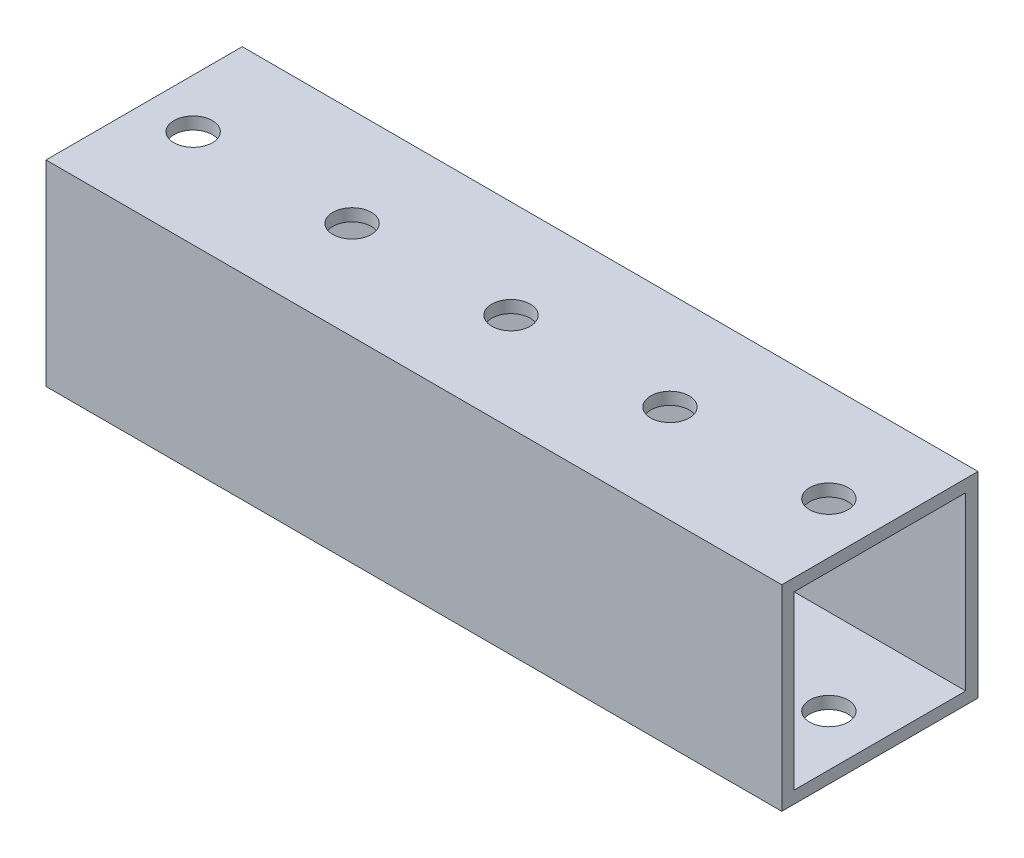
ISO-10303-21;
HEADER;
FILE_DESCRIPTION(('STEP AP214'),'2;1');
FILE_NAME('part.step','',(''),(''),'','','');
FILE_SCHEMA(('AUTOMOTIVE_DESIGN { 1 0 10303 214 1 1 1 1 }'));
ENDSEC;
DATA;
#1=APPLICATION_CONTEXT('core data for automotive mechanical design processes');
#2=APPLICATION_PROTOCOL_DEFINITION('international standard','automotive_design',2000,#1);
#3=PRODUCT_CONTEXT('',#1,'mechanical');
#4=PRODUCT('Part','Part','',(#3));
#5=PRODUCT_RELATED_PRODUCT_CATEGORY('part','',(#4));
#6=PRODUCT_DEFINITION_FORMATION('','',#4);
#7=PRODUCT_DEFINITION_CONTEXT('part definition',#1,'design');
#8=PRODUCT_DEFINITION('design','',#6,#7);
#9=PRODUCT_DEFINITION_SHAPE('','',#8);
#10=(LENGTH_UNIT() NAMED_UNIT(*) SI_UNIT(.MILLI.,.METRE.));
#11=(NAMED_UNIT(*) PLANE_ANGLE_UNIT() SI_UNIT($,.RADIAN.));
#12=(NAMED_UNIT(*) SI_UNIT($,.STERADIAN.) SOLID_ANGLE_UNIT());
#13=UNCERTAINTY_MEASURE_WITH_UNIT(LENGTH_MEASURE(1.E-05),#10,'distance_accuracy_value','');
#14=(GEOMETRIC_REPRESENTATION_CONTEXT(3) GLOBAL_UNCERTAINTY_ASSIGNED_CONTEXT((#13)) GLOBAL_UNIT_ASSIGNED_CONTEXT((#10,
#11,#12)) REPRESENTATION_CONTEXT('',''));
#15=CARTESIAN_POINT('',(0.,0.,0.));
#16=DIRECTION('',(0.,0.,1.));
#17=DIRECTION('',(1.,0.,0.));
#18=AXIS2_PLACEMENT_3D('',#15,#16,#17);
#19=CARTESIAN_POINT('',(95.25,0.,0.));
#20=DIRECTION('',(-1.,0.,0.));
#21=DIRECTION('',(0.,0.,1.));
#22=AXIS2_PLACEMENT_3D('',#19,#20,#21);
#23=PLANE('',#22);
#24=DIRECTION('',(0.,-1.,0.));
#25=VECTOR('',#24,1.);
#26=CARTESIAN_POINT('',(95.25,0.,0.));
#27=LINE('',#26,#25);
#28=CARTESIAN_POINT('',(95.25,25.4,0.));
#29=VERTEX_POINT('',#28);
#30=CARTESIAN_POINT('',(95.25,0.,0.));
#31=VERTEX_POINT('',#30);
#32=EDGE_CURVE('E138',#29,#31,#27,.T.);
#33=ORIENTED_EDGE('',*,*,#32,.T.);
#34=DIRECTION('',(0.,0.,-1.));
#35=VECTOR('',#34,1.);
#36=CARTESIAN_POINT('',(95.25,0.,0.));
#37=LINE('',#36,#35);
#38=CARTESIAN_POINT('',(95.25,0.,-25.4));
#39=VERTEX_POINT('',#38);
#40=EDGE_CURVE('E141',#31,#39,#37,.T.);
#41=ORIENTED_EDGE('',*,*,#40,.T.);
#42=DIRECTION('',(0.,1.,0.));
#43=VECTOR('',#42,1.);
#44=CARTESIAN_POINT('',(95.25,0.,-25.4));
#45=LINE('',#44,#43);
#46=CARTESIAN_POINT('',(95.25,25.4,-25.4));
#47=VERTEX_POINT('',#46);
#48=EDGE_CURVE('E144',#39,#47,#45,.T.);
#49=ORIENTED_EDGE('',*,*,#48,.T.);
#50=DIRECTION('',(0.,0.,1.));
#51=VECTOR('',#50,1.);
#52=CARTESIAN_POINT('',(95.25,25.4,0.));
#53=LINE('',#52,#51);
#54=EDGE_CURVE('E146',#47,#29,#53,.T.);
#55=ORIENTED_EDGE('',*,*,#54,.T.);
#56=EDGE_LOOP('',(#33,#41,#49,#55));
#57=FACE_BOUND('',#56,.T.);
#58=DIRECTION('',(0.,-1.,0.));
#59=VECTOR('',#58,1.);
#60=CARTESIAN_POINT('',(95.25,1.5875,-1.5875));
#61=LINE('',#60,#59);
#62=CARTESIAN_POINT('',(95.25,23.8125,-1.5875));
#63=VERTEX_POINT('',#62);
#64=CARTESIAN_POINT('',(95.25,1.5875,-1.5875));
#65=VERTEX_POINT('',#64);
#66=EDGE_CURVE('E100',#63,#65,#61,.T.);
#67=ORIENTED_EDGE('',*,*,#66,.F.);
#68=DIRECTION('',(0.,0.,1.));
#69=VECTOR('',#68,1.);
#70=CARTESIAN_POINT('',(95.25,23.8125,-1.5875));
#71=LINE('',#70,#69);
#72=CARTESIAN_POINT('',(95.25,23.8125,-23.8125));
#73=VERTEX_POINT('',#72);
#74=EDGE_CURVE('E122',#73,#63,#71,.T.);
#75=ORIENTED_EDGE('',*,*,#74,.F.);
#76=DIRECTION('',(0.,1.,0.));
#77=VECTOR('',#76,1.);
#78=CARTESIAN_POINT('',(95.25,1.5875,-23.8125));
#79=LINE('',#78,#77);
#80=CARTESIAN_POINT('',(95.25,1.5875,-23.8125));
#81=VERTEX_POINT('',#80);
#82=EDGE_CURVE('E120',#81,#73,#79,.T.);
#83=ORIENTED_EDGE('',*,*,#82,.F.);
#84=DIRECTION('',(0.,0.,-1.));
#85=VECTOR('',#84,1.);
#86=CARTESIAN_POINT('',(95.25,1.5875,-1.5875));
#87=LINE('',#86,#85);
#88=EDGE_CURVE('E108',#65,#81,#87,.T.);
#89=ORIENTED_EDGE('',*,*,#88,.F.);
#90=EDGE_LOOP('',(#67,#75,#83,#89));
#91=FACE_BOUND('',#90,.T.);
#92=ADVANCED_FACE('F33',(#57,#91),#23,.F.);
#93=CARTESIAN_POINT('',(0.,0.,0.));
#94=DIRECTION('',(-1.,0.,0.));
#95=DIRECTION('',(0.,0.,1.));
#96=AXIS2_PLACEMENT_3D('',#93,#94,#95);
#97=PLANE('',#96);
#98=DIRECTION('',(0.,-1.,0.));
#99=VECTOR('',#98,1.);
#100=CARTESIAN_POINT('',(0.,0.,0.));
#101=LINE('',#100,#99);
#102=CARTESIAN_POINT('',(0.,25.4,0.));
#103=VERTEX_POINT('',#102);
#104=CARTESIAN_POINT('',(0.,0.,0.));
#105=VERTEX_POINT('',#104);
#106=EDGE_CURVE('E116',#103,#105,#101,.T.);
#107=ORIENTED_EDGE('',*,*,#106,.F.);
#108=DIRECTION('',(0.,0.,1.));
#109=VECTOR('',#108,1.);
#110=CARTESIAN_POINT('',(0.,25.4,0.));
#111=LINE('',#110,#109);
#112=CARTESIAN_POINT('',(0.,25.4,-25.4));
#113=VERTEX_POINT('',#112);
#114=EDGE_CURVE('E142',#113,#103,#111,.T.);
#115=ORIENTED_EDGE('',*,*,#114,.F.);
#116=DIRECTION('',(0.,1.,0.));
#117=VECTOR('',#116,1.);
#118=CARTESIAN_POINT('',(0.,0.,-25.4));
#119=LINE('',#118,#117);
#120=CARTESIAN_POINT('',(0.,0.,-25.4));
#121=VERTEX_POINT('',#120);
#122=EDGE_CURVE('E153',#121,#113,#119,.T.);
#123=ORIENTED_EDGE('',*,*,#122,.F.);
#124=DIRECTION('',(0.,0.,-1.));
#125=VECTOR('',#124,1.);
#126=CARTESIAN_POINT('',(0.,0.,0.));
#127=LINE('',#126,#125);
#128=EDGE_CURVE('E151',#105,#121,#127,.T.);
#129=ORIENTED_EDGE('',*,*,#128,.F.);
#130=EDGE_LOOP('',(#107,#115,#123,#129));
#131=FACE_BOUND('',#130,.T.);
#132=DIRECTION('',(0.,0.,1.));
#133=VECTOR('',#132,1.);
#134=CARTESIAN_POINT('',(0.,23.8125,-1.5875));
#135=LINE('',#134,#133);
#136=CARTESIAN_POINT('',(0.,23.8125,-23.8125));
#137=VERTEX_POINT('',#136);
#138=CARTESIAN_POINT('',(0.,23.8125,-1.5875));
#139=VERTEX_POINT('',#138);
#140=EDGE_CURVE('E109',#137,#139,#135,.T.);
#141=ORIENTED_EDGE('',*,*,#140,.T.);
#142=DIRECTION('',(0.,-1.,0.));
#143=VECTOR('',#142,1.);
#144=CARTESIAN_POINT('',(0.,1.5875,-1.5875));
#145=LINE('',#144,#143);
#146=CARTESIAN_POINT('',(0.,1.5875,-1.5875));
#147=VERTEX_POINT('',#146);
#148=EDGE_CURVE('E58',#139,#147,#145,.T.);
#149=ORIENTED_EDGE('',*,*,#148,.T.);
#150=DIRECTION('',(0.,0.,-1.));
#151=VECTOR('',#150,1.);
#152=CARTESIAN_POINT('',(0.,1.5875,-1.5875));
#153=LINE('',#152,#151);
#154=CARTESIAN_POINT('',(0.,1.5875,-23.8125));
#155=VERTEX_POINT('',#154);
#156=EDGE_CURVE('E115',#147,#155,#153,.T.);
#157=ORIENTED_EDGE('',*,*,#156,.T.);
#158=DIRECTION('',(0.,1.,0.));
#159=VECTOR('',#158,1.);
#160=CARTESIAN_POINT('',(0.,1.5875,-23.8125));
#161=LINE('',#160,#159);
#162=EDGE_CURVE('E130',#155,#137,#161,.T.);
#163=ORIENTED_EDGE('',*,*,#162,.T.);
#164=EDGE_LOOP('',(#141,#149,#157,#163));
#165=FACE_BOUND('',#164,.T.);
#166=ADVANCED_FACE('F221',(#131,#165),#97,.T.);
#167=CARTESIAN_POINT('',(95.25,0.,0.));
#168=DIRECTION('',(0.,0.,-1.));
#169=DIRECTION('',(-1.,0.,0.));
#170=AXIS2_PLACEMENT_3D('',#167,#168,#169);
#171=PLANE('',#170);
#172=ORIENTED_EDGE('',*,*,#106,.T.);
#173=DIRECTION('',(-1.,0.,0.));
#174=VECTOR('',#173,1.);
#175=CARTESIAN_POINT('',(95.25,0.,0.));
#176=LINE('',#175,#174);
#177=EDGE_CURVE('E11',#31,#105,#176,.T.);
#178=ORIENTED_EDGE('',*,*,#177,.F.);
#179=ORIENTED_EDGE('',*,*,#32,.F.);
#180=DIRECTION('',(-1.,0.,0.));
#181=VECTOR('',#180,1.);
#182=CARTESIAN_POINT('',(95.25,25.4,0.));
#183=LINE('',#182,#181);
#184=EDGE_CURVE('E148',#29,#103,#183,.T.);
#185=ORIENTED_EDGE('',*,*,#184,.T.);
#186=EDGE_LOOP('',(#172,#178,#179,#185));
#187=FACE_BOUND('',#186,.T.);
#188=ADVANCED_FACE('F35',(#187),#171,.F.);
#189=CARTESIAN_POINT('',(95.25,0.,0.));
#190=DIRECTION('',(0.,1.,0.));
#191=DIRECTION('',(0.,0.,1.));
#192=AXIS2_PLACEMENT_3D('',#189,#190,#191);
#193=PLANE('',#192);
#194=CARTESIAN_POINT('',(6.35,0.,-12.7));
#195=DIRECTION('',(0.,1.,0.));
#196=DIRECTION('',(0.,0.,1.));
#197=AXIS2_PLACEMENT_3D('',#194,#195,#196);
#198=CIRCLE('',#197,2.4892);
#199=CARTESIAN_POINT('',(6.35,0.,-10.2108));
#200=VERTEX_POINT('',#199);
#201=EDGE_CURVE('E128',#200,#200,#198,.T.);
#202=ORIENTED_EDGE('',*,*,#201,.T.);
#203=EDGE_LOOP('',(#202));
#204=FACE_BOUND('',#203,.T.);
#205=CARTESIAN_POINT('',(26.924,0.,-12.7));
#206=DIRECTION('',(0.,1.,0.));
#207=DIRECTION('',(0.,0.,1.));
#208=AXIS2_PLACEMENT_3D('',#205,#206,#207);
#209=CIRCLE('',#208,2.4892);
#210=CARTESIAN_POINT('',(26.924,0.,-10.2108));
#211=VERTEX_POINT('',#210);
#212=EDGE_CURVE('E184',#211,#211,#209,.T.);
#213=ORIENTED_EDGE('',*,*,#212,.T.);
#214=EDGE_LOOP('',(#213));
#215=FACE_BOUND('',#214,.T.);
#216=CARTESIAN_POINT('',(47.498,0.,-12.7));
#217=DIRECTION('',(0.,1.,0.));
#218=DIRECTION('',(0.,0.,1.));
#219=AXIS2_PLACEMENT_3D('',#216,#217,#218);
#220=CIRCLE('',#219,2.4892);
#221=CARTESIAN_POINT('',(47.498,0.,-10.2108));
#222=VERTEX_POINT('',#221);
#223=EDGE_CURVE('E180',#222,#222,#220,.T.);
#224=ORIENTED_EDGE('',*,*,#223,.T.);
#225=EDGE_LOOP('',(#224));
#226=FACE_BOUND('',#225,.T.);
#227=CARTESIAN_POINT('',(68.072,0.,-12.7));
#228=DIRECTION('',(0.,1.,0.));
#229=DIRECTION('',(0.,0.,1.));
#230=AXIS2_PLACEMENT_3D('',#227,#228,#229);
#231=CIRCLE('',#230,2.4892);
#232=CARTESIAN_POINT('',(68.072,0.,-10.2108));
#233=VERTEX_POINT('',#232);
#234=EDGE_CURVE('E176',#233,#233,#231,.T.);
#235=ORIENTED_EDGE('',*,*,#234,.T.);
#236=EDGE_LOOP('',(#235));
#237=FACE_BOUND('',#236,.T.);
#238=CARTESIAN_POINT('',(88.646,0.,-12.7));
#239=DIRECTION('',(0.,1.,0.));
#240=DIRECTION('',(0.,0.,1.));
#241=AXIS2_PLACEMENT_3D('',#238,#239,#240);
#242=CIRCLE('',#241,2.4892);
#243=CARTESIAN_POINT('',(88.646,0.,-10.2108));
#244=VERTEX_POINT('',#243);
#245=EDGE_CURVE('E172',#244,#244,#242,.T.);
#246=ORIENTED_EDGE('',*,*,#245,.T.);
#247=EDGE_LOOP('',(#246));
#248=FACE_BOUND('',#247,.T.);
#249=ORIENTED_EDGE('',*,*,#128,.T.);
#250=DIRECTION('',(-1.,0.,0.));
#251=VECTOR('',#250,1.);
#252=CARTESIAN_POINT('',(95.25,0.,-25.4));
#253=LINE('',#252,#251);
#254=EDGE_CURVE('E42',#39,#121,#253,.T.);
#255=ORIENTED_EDGE('',*,*,#254,.F.);
#256=ORIENTED_EDGE('',*,*,#40,.F.);
#257=ORIENTED_EDGE('',*,*,#177,.T.);
#258=EDGE_LOOP('',(#249,#255,#256,#257));
#259=FACE_BOUND('',#258,.T.);
#260=ADVANCED_FACE('F201',(#204,#215,#226,#237,#248,#259),#193,.F.);
#261=CARTESIAN_POINT('',(95.25,0.,-25.4));
#262=DIRECTION('',(0.,0.,1.));
#263=DIRECTION('',(1.,0.,0.));
#264=AXIS2_PLACEMENT_3D('',#261,#262,#263);
#265=PLANE('',#264);
#266=ORIENTED_EDGE('',*,*,#122,.T.);
#267=DIRECTION('',(-1.,0.,0.));
#268=VECTOR('',#267,1.);
#269=CARTESIAN_POINT('',(95.25,25.4,-25.4));
#270=LINE('',#269,#268);
#271=EDGE_CURVE('E158',#47,#113,#270,.T.);
#272=ORIENTED_EDGE('',*,*,#271,.F.);
#273=ORIENTED_EDGE('',*,*,#48,.F.);
#274=ORIENTED_EDGE('',*,*,#254,.T.);
#275=EDGE_LOOP('',(#266,#272,#273,#274));
#276=FACE_BOUND('',#275,.T.);
#277=ADVANCED_FACE('F235',(#276),#265,.F.);
#278=CARTESIAN_POINT('',(95.25,25.4,0.));
#279=DIRECTION('',(0.,-1.,0.));
#280=DIRECTION('',(0.,0.,-1.));
#281=AXIS2_PLACEMENT_3D('',#278,#279,#280);
#282=PLANE('',#281);
#283=CARTESIAN_POINT('',(6.35,25.4,-12.7));
#284=DIRECTION('',(0.,1.,0.));
#285=DIRECTION('',(0.,0.,1.));
#286=AXIS2_PLACEMENT_3D('',#283,#284,#285);
#287=CIRCLE('',#286,2.4892);
#288=CARTESIAN_POINT('',(6.35,25.4,-10.2108));
#289=VERTEX_POINT('',#288);
#290=EDGE_CURVE('E167',#289,#289,#287,.T.);
#291=ORIENTED_EDGE('',*,*,#290,.F.);
#292=EDGE_LOOP('',(#291));
#293=FACE_BOUND('',#292,.T.);
#294=CARTESIAN_POINT('',(26.924,25.4,-12.7));
#295=DIRECTION('',(0.,1.,0.));
#296=DIRECTION('',(0.,0.,1.));
#297=AXIS2_PLACEMENT_3D('',#294,#295,#296);
#298=CIRCLE('',#297,2.4892);
#299=CARTESIAN_POINT('',(26.924,25.4,-10.2108));
#300=VERTEX_POINT('',#299);
#301=EDGE_CURVE('E331',#300,#300,#298,.T.);
#302=ORIENTED_EDGE('',*,*,#301,.F.);
#303=EDGE_LOOP('',(#302));
#304=FACE_BOUND('',#303,.T.);
#305=CARTESIAN_POINT('',(47.498,25.4,-12.7));
#306=DIRECTION('',(0.,1.,0.));
#307=DIRECTION('',(0.,0.,1.));
#308=AXIS2_PLACEMENT_3D('',#305,#306,#307);
#309=CIRCLE('',#308,2.4892);
#310=CARTESIAN_POINT('',(47.498,25.4,-10.2108));
#311=VERTEX_POINT('',#310);
#312=EDGE_CURVE('E329',#311,#311,#309,.T.);
#313=ORIENTED_EDGE('',*,*,#312,.F.);
#314=EDGE_LOOP('',(#313));
#315=FACE_BOUND('',#314,.T.);
#316=CARTESIAN_POINT('',(68.072,25.4,-12.7));
#317=DIRECTION('',(0.,1.,0.));
#318=DIRECTION('',(0.,0.,1.));
#319=AXIS2_PLACEMENT_3D('',#316,#317,#318);
#320=CIRCLE('',#319,2.4892);
#321=CARTESIAN_POINT('',(68.072,25.4,-10.2108));
#322=VERTEX_POINT('',#321);
#323=EDGE_CURVE('E327',#322,#322,#320,.T.);
#324=ORIENTED_EDGE('',*,*,#323,.F.);
#325=EDGE_LOOP('',(#324));
#326=FACE_BOUND('',#325,.T.);
#327=CARTESIAN_POINT('',(88.646,25.4,-12.7));
#328=DIRECTION('',(0.,1.,0.));
#329=DIRECTION('',(0.,0.,1.));
#330=AXIS2_PLACEMENT_3D('',#327,#328,#329);
#331=CIRCLE('',#330,2.4892);
#332=CARTESIAN_POINT('',(88.646,25.4,-10.2108));
#333=VERTEX_POINT('',#332);
#334=EDGE_CURVE('E299',#333,#333,#331,.T.);
#335=ORIENTED_EDGE('',*,*,#334,.F.);
#336=EDGE_LOOP('',(#335));
#337=FACE_BOUND('',#336,.T.);
#338=ORIENTED_EDGE('',*,*,#114,.T.);
#339=ORIENTED_EDGE('',*,*,#184,.F.);
#340=ORIENTED_EDGE('',*,*,#54,.F.);
#341=ORIENTED_EDGE('',*,*,#271,.T.);
#342=EDGE_LOOP('',(#338,#339,#340,#341));
#343=FACE_BOUND('',#342,.T.);
#344=ADVANCED_FACE('F232',(#293,#304,#315,#326,#337,#343),#282,.F.);
#345=CARTESIAN_POINT('',(95.25,1.5875,-1.5875));
#346=DIRECTION('',(0.,0.,-1.));
#347=DIRECTION('',(-1.,0.,0.));
#348=AXIS2_PLACEMENT_3D('',#345,#346,#347);
#349=PLANE('',#348);
#350=ORIENTED_EDGE('',*,*,#148,.F.);
#351=DIRECTION('',(-1.,0.,0.));
#352=VECTOR('',#351,1.);
#353=CARTESIAN_POINT('',(95.25,23.8125,-1.5875));
#354=LINE('',#353,#352);
#355=EDGE_CURVE('E104',#63,#139,#354,.T.);
#356=ORIENTED_EDGE('',*,*,#355,.F.);
#357=ORIENTED_EDGE('',*,*,#66,.T.);
#358=DIRECTION('',(-1.,0.,0.));
#359=VECTOR('',#358,1.);
#360=CARTESIAN_POINT('',(95.25,1.5875,-1.5875));
#361=LINE('',#360,#359);
#362=EDGE_CURVE('E103',#65,#147,#361,.T.);
#363=ORIENTED_EDGE('',*,*,#362,.T.);
#364=EDGE_LOOP('',(#350,#356,#357,#363));
#365=FACE_BOUND('',#364,.T.);
#366=ADVANCED_FACE('F102',(#365),#349,.T.);
#367=CARTESIAN_POINT('',(95.25,1.5875,-1.5875));
#368=DIRECTION('',(0.,1.,0.));
#369=DIRECTION('',(0.,0.,1.));
#370=AXIS2_PLACEMENT_3D('',#367,#368,#369);
#371=PLANE('',#370);
#372=CARTESIAN_POINT('',(6.35,1.58750000000001,-12.7));
#373=DIRECTION('',(0.,1.,0.));
#374=DIRECTION('',(0.,0.,1.));
#375=AXIS2_PLACEMENT_3D('',#372,#373,#374);
#376=CIRCLE('',#375,2.4892);
#377=CARTESIAN_POINT('',(6.35,1.58750000000001,-10.2108));
#378=VERTEX_POINT('',#377);
#379=EDGE_CURVE('E196',#378,#378,#376,.T.);
#380=ORIENTED_EDGE('',*,*,#379,.F.);
#381=EDGE_LOOP('',(#380));
#382=FACE_BOUND('',#381,.T.);
#383=CARTESIAN_POINT('',(26.924,1.58750000000001,-12.7));
#384=DIRECTION('',(0.,1.,0.));
#385=DIRECTION('',(0.,0.,1.));
#386=AXIS2_PLACEMENT_3D('',#383,#384,#385);
#387=CIRCLE('',#386,2.4892);
#388=CARTESIAN_POINT('',(26.924,1.58750000000001,-10.2108));
#389=VERTEX_POINT('',#388);
#390=EDGE_CURVE('E179',#389,#389,#387,.T.);
#391=ORIENTED_EDGE('',*,*,#390,.F.);
#392=EDGE_LOOP('',(#391));
#393=FACE_BOUND('',#392,.T.);
#394=CARTESIAN_POINT('',(47.498,1.58750000000001,-12.7));
#395=DIRECTION('',(0.,1.,0.));
#396=DIRECTION('',(0.,0.,1.));
#397=AXIS2_PLACEMENT_3D('',#394,#395,#396);
#398=CIRCLE('',#397,2.4892);
#399=CARTESIAN_POINT('',(47.498,1.58750000000001,-10.2108));
#400=VERTEX_POINT('',#399);
#401=EDGE_CURVE('E175',#400,#400,#398,.T.);
#402=ORIENTED_EDGE('',*,*,#401,.F.);
#403=EDGE_LOOP('',(#402));
#404=FACE_BOUND('',#403,.T.);
#405=CARTESIAN_POINT('',(68.072,1.58750000000001,-12.7));
#406=DIRECTION('',(0.,1.,0.));
#407=DIRECTION('',(0.,0.,1.));
#408=AXIS2_PLACEMENT_3D('',#405,#406,#407);
#409=CIRCLE('',#408,2.4892);
#410=CARTESIAN_POINT('',(68.072,1.58750000000001,-10.2108));
#411=VERTEX_POINT('',#410);
#412=EDGE_CURVE('E171',#411,#411,#409,.T.);
#413=ORIENTED_EDGE('',*,*,#412,.F.);
#414=EDGE_LOOP('',(#413));
#415=FACE_BOUND('',#414,.T.);
#416=CARTESIAN_POINT('',(88.646,1.58750000000001,-12.7));
#417=DIRECTION('',(0.,1.,0.));
#418=DIRECTION('',(0.,0.,1.));
#419=AXIS2_PLACEMENT_3D('',#416,#417,#418);
#420=CIRCLE('',#419,2.4892);
#421=CARTESIAN_POINT('',(88.646,1.58750000000001,-10.2108));
#422=VERTEX_POINT('',#421);
#423=EDGE_CURVE('E166',#422,#422,#420,.T.);
#424=ORIENTED_EDGE('',*,*,#423,.F.);
#425=EDGE_LOOP('',(#424));
#426=FACE_BOUND('',#425,.T.);
#427=ORIENTED_EDGE('',*,*,#156,.F.);
#428=ORIENTED_EDGE('',*,*,#362,.F.);
#429=ORIENTED_EDGE('',*,*,#88,.T.);
#430=DIRECTION('',(-1.,0.,0.));
#431=VECTOR('',#430,1.);
#432=CARTESIAN_POINT('',(95.25,1.5875,-23.8125));
#433=LINE('',#432,#431);
#434=EDGE_CURVE('E117',#81,#155,#433,.T.);
#435=ORIENTED_EDGE('',*,*,#434,.T.);
#436=EDGE_LOOP('',(#427,#428,#429,#435));
#437=FACE_BOUND('',#436,.T.);
#438=ADVANCED_FACE('F112',(#382,#393,#404,#415,#426,#437),#371,.T.);
#439=CARTESIAN_POINT('',(95.25,1.5875,-23.8125));
#440=DIRECTION('',(0.,0.,1.));
#441=DIRECTION('',(1.,0.,0.));
#442=AXIS2_PLACEMENT_3D('',#439,#440,#441);
#443=PLANE('',#442);
#444=ORIENTED_EDGE('',*,*,#162,.F.);
#445=ORIENTED_EDGE('',*,*,#434,.F.);
#446=ORIENTED_EDGE('',*,*,#82,.T.);
#447=DIRECTION('',(-1.,0.,0.));
#448=VECTOR('',#447,1.);
#449=CARTESIAN_POINT('',(95.25,23.8125,-23.8125));
#450=LINE('',#449,#448);
#451=EDGE_CURVE('E50',#73,#137,#450,.T.);
#452=ORIENTED_EDGE('',*,*,#451,.T.);
#453=EDGE_LOOP('',(#444,#445,#446,#452));
#454=FACE_BOUND('',#453,.T.);
#455=ADVANCED_FACE('F263',(#454),#443,.T.);
#456=CARTESIAN_POINT('',(95.25,23.8125,-1.5875));
#457=DIRECTION('',(0.,-1.,0.));
#458=DIRECTION('',(0.,0.,-1.));
#459=AXIS2_PLACEMENT_3D('',#456,#457,#458);
#460=PLANE('',#459);
#461=CARTESIAN_POINT('',(6.35,23.8125,-12.7));
#462=DIRECTION('',(0.,-1.,0.));
#463=DIRECTION('',(0.,0.,-1.));
#464=AXIS2_PLACEMENT_3D('',#461,#462,#463);
#465=CIRCLE('',#464,2.4892);
#466=CARTESIAN_POINT('',(6.35,23.8125,-15.1892));
#467=VERTEX_POINT('',#466);
#468=EDGE_CURVE('E37',#467,#467,#465,.T.);
#469=ORIENTED_EDGE('',*,*,#468,.F.);
#470=EDGE_LOOP('',(#469));
#471=FACE_BOUND('',#470,.T.);
#472=CARTESIAN_POINT('',(26.924,23.8125,-12.7));
#473=DIRECTION('',(0.,-1.,0.));
#474=DIRECTION('',(0.,0.,-1.));
#475=AXIS2_PLACEMENT_3D('',#472,#473,#474);
#476=CIRCLE('',#475,2.4892);
#477=CARTESIAN_POINT('',(26.924,23.8125,-15.1892));
#478=VERTEX_POINT('',#477);
#479=EDGE_CURVE('E177',#478,#478,#476,.T.);
#480=ORIENTED_EDGE('',*,*,#479,.F.);
#481=EDGE_LOOP('',(#480));
#482=FACE_BOUND('',#481,.T.);
#483=CARTESIAN_POINT('',(47.498,23.8125,-12.7));
#484=DIRECTION('',(0.,-1.,0.));
#485=DIRECTION('',(0.,0.,-1.));
#486=AXIS2_PLACEMENT_3D('',#483,#484,#485);
#487=CIRCLE('',#486,2.4892);
#488=CARTESIAN_POINT('',(47.498,23.8125,-15.1892));
#489=VERTEX_POINT('',#488);
#490=EDGE_CURVE('E173',#489,#489,#487,.T.);
#491=ORIENTED_EDGE('',*,*,#490,.F.);
#492=EDGE_LOOP('',(#491));
#493=FACE_BOUND('',#492,.T.);
#494=CARTESIAN_POINT('',(68.072,23.8125,-12.7));
#495=DIRECTION('',(0.,-1.,0.));
#496=DIRECTION('',(0.,0.,-1.));
#497=AXIS2_PLACEMENT_3D('',#494,#495,#496);
#498=CIRCLE('',#497,2.4892);
#499=CARTESIAN_POINT('',(68.072,23.8125,-15.1892));
#500=VERTEX_POINT('',#499);
#501=EDGE_CURVE('E168',#500,#500,#498,.T.);
#502=ORIENTED_EDGE('',*,*,#501,.F.);
#503=EDGE_LOOP('',(#502));
#504=FACE_BOUND('',#503,.T.);
#505=CARTESIAN_POINT('',(88.646,23.8125,-12.7));
#506=DIRECTION('',(0.,-1.,0.));
#507=DIRECTION('',(0.,0.,-1.));
#508=AXIS2_PLACEMENT_3D('',#505,#506,#507);
#509=CIRCLE('',#508,2.4892);
#510=CARTESIAN_POINT('',(88.646,23.8125,-15.1892));
#511=VERTEX_POINT('',#510);
#512=EDGE_CURVE('E163',#511,#511,#509,.T.);
#513=ORIENTED_EDGE('',*,*,#512,.F.);
#514=EDGE_LOOP('',(#513));
#515=FACE_BOUND('',#514,.T.);
#516=ORIENTED_EDGE('',*,*,#140,.F.);
#517=ORIENTED_EDGE('',*,*,#451,.F.);
#518=ORIENTED_EDGE('',*,*,#74,.T.);
#519=ORIENTED_EDGE('',*,*,#355,.T.);
#520=EDGE_LOOP('',(#516,#517,#518,#519));
#521=FACE_BOUND('',#520,.T.);
#522=ADVANCED_FACE('F260',(#471,#482,#493,#504,#515,#521),#460,.T.);
#523=CARTESIAN_POINT('',(88.646,-69.85,-12.7));
#524=DIRECTION('',(0.,1.,0.));
#525=DIRECTION('',(0.,0.,1.));
#526=AXIS2_PLACEMENT_3D('',#523,#524,#525);
#527=CYLINDRICAL_SURFACE('',#526,2.4892);
#528=ORIENTED_EDGE('',*,*,#512,.T.);
#529=EDGE_LOOP('',(#528));
#530=FACE_BOUND('',#529,.T.);
#531=ORIENTED_EDGE('',*,*,#334,.T.);
#532=EDGE_LOOP('',(#531));
#533=FACE_BOUND('',#532,.T.);
#534=ADVANCED_FACE('F262',(#530,#533),#527,.F.);
#535=CARTESIAN_POINT('',(68.072,-69.85,-12.7));
#536=DIRECTION('',(0.,1.,0.));
#537=DIRECTION('',(0.,0.,1.));
#538=AXIS2_PLACEMENT_3D('',#535,#536,#537);
#539=CYLINDRICAL_SURFACE('',#538,2.4892);
#540=ORIENTED_EDGE('',*,*,#501,.T.);
#541=EDGE_LOOP('',(#540));
#542=FACE_BOUND('',#541,.T.);
#543=ORIENTED_EDGE('',*,*,#323,.T.);
#544=EDGE_LOOP('',(#543));
#545=FACE_BOUND('',#544,.T.);
#546=ADVANCED_FACE('F270',(#542,#545),#539,.F.);
#547=CARTESIAN_POINT('',(47.498,-69.85,-12.7));
#548=DIRECTION('',(0.,1.,0.));
#549=DIRECTION('',(0.,0.,1.));
#550=AXIS2_PLACEMENT_3D('',#547,#548,#549);
#551=CYLINDRICAL_SURFACE('',#550,2.4892);
#552=ORIENTED_EDGE('',*,*,#490,.T.);
#553=EDGE_LOOP('',(#552));
#554=FACE_BOUND('',#553,.T.);
#555=ORIENTED_EDGE('',*,*,#312,.T.);
#556=EDGE_LOOP('',(#555));
#557=FACE_BOUND('',#556,.T.);
#558=ADVANCED_FACE('F316',(#554,#557),#551,.F.);
#559=CARTESIAN_POINT('',(26.924,-69.85,-12.7));
#560=DIRECTION('',(0.,1.,0.));
#561=DIRECTION('',(0.,0.,1.));
#562=AXIS2_PLACEMENT_3D('',#559,#560,#561);
#563=CYLINDRICAL_SURFACE('',#562,2.4892);
#564=ORIENTED_EDGE('',*,*,#479,.T.);
#565=EDGE_LOOP('',(#564));
#566=FACE_BOUND('',#565,.T.);
#567=ORIENTED_EDGE('',*,*,#301,.T.);
#568=EDGE_LOOP('',(#567));
#569=FACE_BOUND('',#568,.T.);
#570=ADVANCED_FACE('F216',(#566,#569),#563,.F.);
#571=CARTESIAN_POINT('',(6.35,-69.85,-12.7));
#572=DIRECTION('',(0.,1.,0.));
#573=DIRECTION('',(0.,0.,1.));
#574=AXIS2_PLACEMENT_3D('',#571,#572,#573);
#575=CYLINDRICAL_SURFACE('',#574,2.4892);
#576=ORIENTED_EDGE('',*,*,#468,.T.);
#577=EDGE_LOOP('',(#576));
#578=FACE_BOUND('',#577,.T.);
#579=ORIENTED_EDGE('',*,*,#290,.T.);
#580=EDGE_LOOP('',(#579));
#581=FACE_BOUND('',#580,.T.);
#582=ADVANCED_FACE('F209',(#578,#581),#575,.F.);
#583=ORIENTED_EDGE('',*,*,#423,.T.);
#584=EDGE_LOOP('',(#583));
#585=FACE_BOUND('',#584,.T.);
#586=ORIENTED_EDGE('',*,*,#245,.F.);
#587=EDGE_LOOP('',(#586));
#588=FACE_BOUND('',#587,.T.);
#589=ADVANCED_FACE('F218',(#585,#588),#527,.F.);
#590=ORIENTED_EDGE('',*,*,#412,.T.);
#591=EDGE_LOOP('',(#590));
#592=FACE_BOUND('',#591,.T.);
#593=ORIENTED_EDGE('',*,*,#234,.F.);
#594=EDGE_LOOP('',(#593));
#595=FACE_BOUND('',#594,.T.);
#596=ADVANCED_FACE('F307',(#592,#595),#539,.F.);
#597=ORIENTED_EDGE('',*,*,#401,.T.);
#598=EDGE_LOOP('',(#597));
#599=FACE_BOUND('',#598,.T.);
#600=ORIENTED_EDGE('',*,*,#223,.F.);
#601=EDGE_LOOP('',(#600));
#602=FACE_BOUND('',#601,.T.);
#603=ADVANCED_FACE('F213',(#599,#602),#551,.F.);
#604=ORIENTED_EDGE('',*,*,#390,.T.);
#605=EDGE_LOOP('',(#604));
#606=FACE_BOUND('',#605,.T.);
#607=ORIENTED_EDGE('',*,*,#212,.F.);
#608=EDGE_LOOP('',(#607));
#609=FACE_BOUND('',#608,.T.);
#610=ADVANCED_FACE('F206',(#606,#609),#563,.F.);
#611=ORIENTED_EDGE('',*,*,#379,.T.);
#612=EDGE_LOOP('',(#611));
#613=FACE_BOUND('',#612,.T.);
#614=ORIENTED_EDGE('',*,*,#201,.F.);
#615=EDGE_LOOP('',(#614));
#616=FACE_BOUND('',#615,.T.);
#617=ADVANCED_FACE('F204',(#613,#616),#575,.F.);
#618=CLOSED_SHELL('',(#92,#166,#188,#260,#277,#344,#366,#438,#455,#522,#534,#546,#558,#570,#582,
#589,#596,#603,#610,#617));
#619=MANIFOLD_SOLID_BREP('B2',#618);
#620=ADVANCED_BREP_SHAPE_REPRESENTATION('',(#18,#619),#14);
#621=SHAPE_DEFINITION_REPRESENTATION(#9,#620);
ENDSEC;
END-ISO-10303-21;
